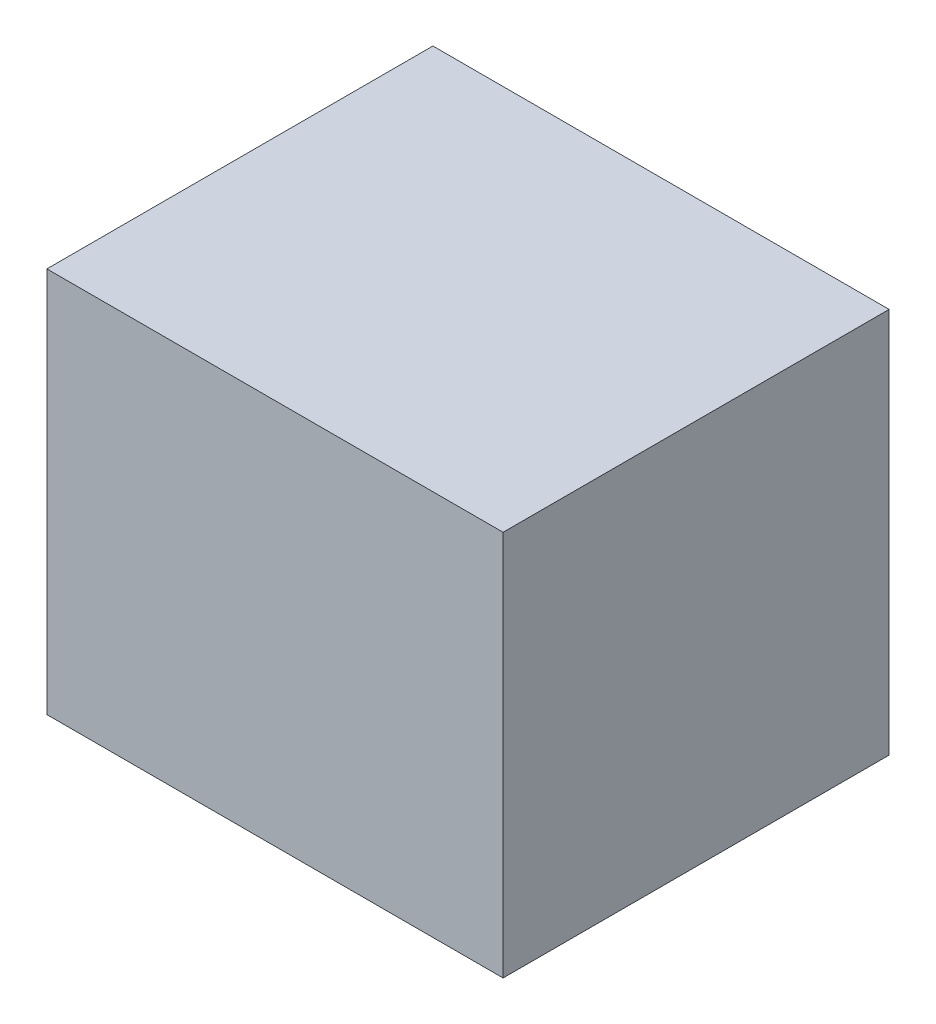
ISO-10303-21;
HEADER;
FILE_DESCRIPTION(('STEP AP214'),'2;1');
FILE_NAME('part.step','',(''),(''),'','','');
FILE_SCHEMA(('AUTOMOTIVE_DESIGN { 1 0 10303 214 1 1 1 1 }'));
ENDSEC;
DATA;
#1=APPLICATION_CONTEXT('core data for automotive mechanical design processes');
#2=APPLICATION_PROTOCOL_DEFINITION('international standard','automotive_design',2000,#1);
#3=PRODUCT_CONTEXT('',#1,'mechanical');
#4=PRODUCT('Part','Part','',(#3));
#5=PRODUCT_RELATED_PRODUCT_CATEGORY('part','',(#4));
#6=PRODUCT_DEFINITION_FORMATION('','',#4);
#7=PRODUCT_DEFINITION_CONTEXT('part definition',#1,'design');
#8=PRODUCT_DEFINITION('design','',#6,#7);
#9=PRODUCT_DEFINITION_SHAPE('','',#8);
#10=(LENGTH_UNIT() NAMED_UNIT(*) SI_UNIT(.MILLI.,.METRE.));
#11=(NAMED_UNIT(*) PLANE_ANGLE_UNIT() SI_UNIT($,.RADIAN.));
#12=(NAMED_UNIT(*) SI_UNIT($,.STERADIAN.) SOLID_ANGLE_UNIT());
#13=UNCERTAINTY_MEASURE_WITH_UNIT(LENGTH_MEASURE(1.E-05),#10,'distance_accuracy_value','');
#14=(GEOMETRIC_REPRESENTATION_CONTEXT(3) GLOBAL_UNCERTAINTY_ASSIGNED_CONTEXT((#13)) GLOBAL_UNIT_ASSIGNED_CONTEXT((#10,
#11,#12)) REPRESENTATION_CONTEXT('',''));
#15=CARTESIAN_POINT('',(0.,0.,0.));
#16=DIRECTION('',(0.,0.,1.));
#17=DIRECTION('',(1.,0.,0.));
#18=AXIS2_PLACEMENT_3D('',#15,#16,#17);
#19=CARTESIAN_POINT('',(325.,275.,0.));
#20=DIRECTION('',(0.707106781186546,0.,-0.707106781186549));
#21=DIRECTION('',(-0.707106781186549,0.,-0.707106781186546));
#22=AXIS2_PLACEMENT_3D('',#19,#20,#21);
#23=PLANE('',#22);
#24=DIRECTION('',(0.,1.,0.));
#25=VECTOR('',#24,1.);
#26=CARTESIAN_POINT('',(325.,275.,0.));
#27=LINE('',#26,#25);
#28=CARTESIAN_POINT('',(325.,-275.,0.));
#29=VERTEX_POINT('',#28);
#30=CARTESIAN_POINT('',(325.,275.,0.));
#31=VERTEX_POINT('',#30);
#32=EDGE_CURVE('E126',#29,#31,#27,.T.);
#33=ORIENTED_EDGE('',*,*,#32,.F.);
#34=DIRECTION('',(0.577350269189627,-0.577350269189627,0.577350269189624));
#35=VECTOR('',#34,1.);
#36=CARTESIAN_POINT('',(108.333333333333,-58.3333333333329,-216.666666666666));
#37=LINE('',#36,#35);
#38=CARTESIAN_POINT('',(295.,-245.,-30.));
#39=VERTEX_POINT('',#38);
#40=EDGE_CURVE('E11',#39,#29,#37,.T.);
#41=ORIENTED_EDGE('',*,*,#40,.F.);
#42=DIRECTION('',(0.,1.,0.));
#43=VECTOR('',#42,1.);
#44=CARTESIAN_POINT('',(295.,0.,-30.));
#45=LINE('',#44,#43);
#46=CARTESIAN_POINT('',(295.,245.,-30.));
#47=VERTEX_POINT('',#46);
#48=EDGE_CURVE('E146',#39,#47,#45,.T.);
#49=ORIENTED_EDGE('',*,*,#48,.T.);
#50=DIRECTION('',(0.577350269189626,0.577350269189627,0.577350269189624));
#51=VECTOR('',#50,1.);
#52=CARTESIAN_POINT('',(325.,275.,0.));
#53=LINE('',#52,#51);
#54=EDGE_CURVE('E77',#47,#31,#53,.T.);
#55=ORIENTED_EDGE('',*,*,#54,.T.);
#56=EDGE_LOOP('',(#33,#41,#49,#55));
#57=FACE_BOUND('',#56,.T.);
#58=ADVANCED_FACE('F39',(#57),#23,.T.);
#59=CARTESIAN_POINT('',(-325.,-275.,0.));
#60=DIRECTION('',(0.,-0.707106781186546,-0.707106781186549));
#61=DIRECTION('',(0.,0.707106781186549,-0.707106781186546));
#62=AXIS2_PLACEMENT_3D('',#59,#60,#61);
#63=PLANE('',#62);
#64=DIRECTION('',(1.,0.,0.));
#65=VECTOR('',#64,1.);
#66=CARTESIAN_POINT('',(-325.,-275.,0.));
#67=LINE('',#66,#65);
#68=CARTESIAN_POINT('',(-325.,-275.,0.));
#69=VERTEX_POINT('',#68);
#70=EDGE_CURVE('E143',#69,#29,#67,.T.);
#71=ORIENTED_EDGE('',*,*,#70,.F.);
#72=DIRECTION('',(-0.577350269189626,-0.577350269189627,0.577350269189624));
#73=VECTOR('',#72,1.);
#74=CARTESIAN_POINT('',(-141.666666666666,-91.6666666666663,-183.333333333333));
#75=LINE('',#74,#73);
#76=CARTESIAN_POINT('',(-295.,-245.,-30.));
#77=VERTEX_POINT('',#76);
#78=EDGE_CURVE('E50',#77,#69,#75,.T.);
#79=ORIENTED_EDGE('',*,*,#78,.F.);
#80=DIRECTION('',(1.,0.,0.));
#81=VECTOR('',#80,1.);
#82=CARTESIAN_POINT('',(0.,-245.,-30.));
#83=LINE('',#82,#81);
#84=EDGE_CURVE('E150',#77,#39,#83,.T.);
#85=ORIENTED_EDGE('',*,*,#84,.T.);
#86=ORIENTED_EDGE('',*,*,#40,.T.);
#87=EDGE_LOOP('',(#71,#79,#85,#86));
#88=FACE_BOUND('',#87,.T.);
#89=ADVANCED_FACE('F41',(#88),#63,.T.);
#90=CARTESIAN_POINT('',(-325.,275.,0.));
#91=DIRECTION('',(-0.707106781186546,0.,-0.707106781186549));
#92=DIRECTION('',(-0.707106781186549,0.,0.707106781186546));
#93=AXIS2_PLACEMENT_3D('',#90,#91,#92);
#94=PLANE('',#93);
#95=DIRECTION('',(0.,-1.,0.));
#96=VECTOR('',#95,1.);
#97=CARTESIAN_POINT('',(-325.,275.,0.));
#98=LINE('',#97,#96);
#99=CARTESIAN_POINT('',(-325.,275.,0.));
#100=VERTEX_POINT('',#99);
#101=EDGE_CURVE('E139',#100,#69,#98,.T.);
#102=ORIENTED_EDGE('',*,*,#101,.F.);
#103=DIRECTION('',(-0.577350269189627,0.577350269189627,0.577350269189624));
#104=VECTOR('',#103,1.);
#105=CARTESIAN_POINT('',(-325.,275.,0.));
#106=LINE('',#105,#104);
#107=CARTESIAN_POINT('',(-295.,245.,-30.));
#108=VERTEX_POINT('',#107);
#109=EDGE_CURVE('E70',#108,#100,#106,.T.);
#110=ORIENTED_EDGE('',*,*,#109,.F.);
#111=DIRECTION('',(0.,-1.,0.));
#112=VECTOR('',#111,1.);
#113=CARTESIAN_POINT('',(-295.,0.,-30.));
#114=LINE('',#113,#112);
#115=EDGE_CURVE('E159',#108,#77,#114,.T.);
#116=ORIENTED_EDGE('',*,*,#115,.T.);
#117=ORIENTED_EDGE('',*,*,#78,.T.);
#118=EDGE_LOOP('',(#102,#110,#116,#117));
#119=FACE_BOUND('',#118,.T.);
#120=ADVANCED_FACE('F182',(#119),#94,.T.);
#121=CARTESIAN_POINT('',(-325.,275.,0.));
#122=DIRECTION('',(0.,0.707106781186546,-0.707106781186549));
#123=DIRECTION('',(0.,0.707106781186549,0.707106781186546));
#124=AXIS2_PLACEMENT_3D('',#121,#122,#123);
#125=PLANE('',#124);
#126=DIRECTION('',(-1.,0.,0.));
#127=VECTOR('',#126,1.);
#128=CARTESIAN_POINT('',(-325.,275.,0.));
#129=LINE('',#128,#127);
#130=EDGE_CURVE('E131',#31,#100,#129,.T.);
#131=ORIENTED_EDGE('',*,*,#130,.F.);
#132=ORIENTED_EDGE('',*,*,#54,.F.);
#133=DIRECTION('',(-1.,0.,0.));
#134=VECTOR('',#133,1.);
#135=CARTESIAN_POINT('',(0.,245.,-30.));
#136=LINE('',#135,#134);
#137=EDGE_CURVE('E43',#47,#108,#136,.T.);
#138=ORIENTED_EDGE('',*,*,#137,.T.);
#139=ORIENTED_EDGE('',*,*,#109,.T.);
#140=EDGE_LOOP('',(#131,#132,#138,#139));
#141=FACE_BOUND('',#140,.T.);
#142=ADVANCED_FACE('F163',(#141),#125,.T.);
#143=CARTESIAN_POINT('',(0.,0.,-30.));
#144=DIRECTION('',(0.,0.,1.));
#145=DIRECTION('',(1.,0.,0.));
#146=AXIS2_PLACEMENT_3D('',#143,#144,#145);
#147=PLANE('',#146);
#148=ORIENTED_EDGE('',*,*,#48,.F.);
#149=ORIENTED_EDGE('',*,*,#84,.F.);
#150=ORIENTED_EDGE('',*,*,#115,.F.);
#151=ORIENTED_EDGE('',*,*,#137,.F.);
#152=EDGE_LOOP('',(#148,#149,#150,#151));
#153=FACE_BOUND('',#152,.T.);
#154=ADVANCED_FACE('F165',(#153),#147,.F.);
#155=CARTESIAN_POINT('',(325.,275.,550.));
#156=DIRECTION('',(-1.,0.,0.));
#157=DIRECTION('',(0.,-1.,0.));
#158=AXIS2_PLACEMENT_3D('',#155,#156,#157);
#159=PLANE('',#158);
#160=ORIENTED_EDGE('',*,*,#32,.T.);
#161=DIRECTION('',(0.,0.,-1.));
#162=VECTOR('',#161,1.);
#163=CARTESIAN_POINT('',(325.,275.,550.));
#164=LINE('',#163,#162);
#165=CARTESIAN_POINT('',(325.,275.,550.));
#166=VERTEX_POINT('',#165);
#167=EDGE_CURVE('E106',#166,#31,#164,.T.);
#168=ORIENTED_EDGE('',*,*,#167,.F.);
#169=DIRECTION('',(0.,1.,0.));
#170=VECTOR('',#169,1.);
#171=CARTESIAN_POINT('',(325.,275.,550.));
#172=LINE('',#171,#170);
#173=CARTESIAN_POINT('',(325.,-275.,550.));
#174=VERTEX_POINT('',#173);
#175=EDGE_CURVE('E114',#174,#166,#172,.T.);
#176=ORIENTED_EDGE('',*,*,#175,.F.);
#177=DIRECTION('',(0.,0.,-1.));
#178=VECTOR('',#177,1.);
#179=CARTESIAN_POINT('',(325.,-275.,550.));
#180=LINE('',#179,#178);
#181=EDGE_CURVE('E173',#174,#29,#180,.T.);
#182=ORIENTED_EDGE('',*,*,#181,.T.);
#183=EDGE_LOOP('',(#160,#168,#176,#182));
#184=FACE_BOUND('',#183,.T.);
#185=ADVANCED_FACE('F125',(#184),#159,.F.);
#186=CARTESIAN_POINT('',(-325.,275.,550.));
#187=DIRECTION('',(0.,-1.,0.));
#188=DIRECTION('',(0.,0.,-1.));
#189=AXIS2_PLACEMENT_3D('',#186,#187,#188);
#190=PLANE('',#189);
#191=ORIENTED_EDGE('',*,*,#130,.T.);
#192=DIRECTION('',(0.,0.,-1.));
#193=VECTOR('',#192,1.);
#194=CARTESIAN_POINT('',(-325.,275.,550.));
#195=LINE('',#194,#193);
#196=CARTESIAN_POINT('',(-325.,275.,550.));
#197=VERTEX_POINT('',#196);
#198=EDGE_CURVE('E109',#197,#100,#195,.T.);
#199=ORIENTED_EDGE('',*,*,#198,.F.);
#200=DIRECTION('',(-1.,0.,0.));
#201=VECTOR('',#200,1.);
#202=CARTESIAN_POINT('',(-325.,275.,550.));
#203=LINE('',#202,#201);
#204=EDGE_CURVE('E101',#166,#197,#203,.T.);
#205=ORIENTED_EDGE('',*,*,#204,.F.);
#206=ORIENTED_EDGE('',*,*,#167,.T.);
#207=EDGE_LOOP('',(#191,#199,#205,#206));
#208=FACE_BOUND('',#207,.T.);
#209=ADVANCED_FACE('F104',(#208),#190,.F.);
#210=CARTESIAN_POINT('',(-325.,275.,550.));
#211=DIRECTION('',(1.,0.,0.));
#212=DIRECTION('',(0.,1.,0.));
#213=AXIS2_PLACEMENT_3D('',#210,#211,#212);
#214=PLANE('',#213);
#215=ORIENTED_EDGE('',*,*,#101,.T.);
#216=DIRECTION('',(0.,0.,-1.));
#217=VECTOR('',#216,1.);
#218=CARTESIAN_POINT('',(-325.,-275.,550.));
#219=LINE('',#218,#217);
#220=CARTESIAN_POINT('',(-325.,-275.,550.));
#221=VERTEX_POINT('',#220);
#222=EDGE_CURVE('E133',#221,#69,#219,.T.);
#223=ORIENTED_EDGE('',*,*,#222,.F.);
#224=DIRECTION('',(0.,-1.,0.));
#225=VECTOR('',#224,1.);
#226=CARTESIAN_POINT('',(-325.,275.,550.));
#227=LINE('',#226,#225);
#228=EDGE_CURVE('E113',#197,#221,#227,.T.);
#229=ORIENTED_EDGE('',*,*,#228,.F.);
#230=ORIENTED_EDGE('',*,*,#198,.T.);
#231=EDGE_LOOP('',(#215,#223,#229,#230));
#232=FACE_BOUND('',#231,.T.);
#233=ADVANCED_FACE('F167',(#232),#214,.F.);
#234=CARTESIAN_POINT('',(-325.,-275.,550.));
#235=DIRECTION('',(0.,1.,0.));
#236=DIRECTION('',(0.,0.,1.));
#237=AXIS2_PLACEMENT_3D('',#234,#235,#236);
#238=PLANE('',#237);
#239=ORIENTED_EDGE('',*,*,#70,.T.);
#240=ORIENTED_EDGE('',*,*,#181,.F.);
#241=DIRECTION('',(1.,0.,0.));
#242=VECTOR('',#241,1.);
#243=CARTESIAN_POINT('',(-325.,-275.,550.));
#244=LINE('',#243,#242);
#245=EDGE_CURVE('E119',#221,#174,#244,.T.);
#246=ORIENTED_EDGE('',*,*,#245,.F.);
#247=ORIENTED_EDGE('',*,*,#222,.T.);
#248=EDGE_LOOP('',(#239,#240,#246,#247));
#249=FACE_BOUND('',#248,.T.);
#250=ADVANCED_FACE('F179',(#249),#238,.F.);
#251=CARTESIAN_POINT('',(0.,0.,550.));
#252=DIRECTION('',(0.,0.,1.));
#253=DIRECTION('',(1.,0.,0.));
#254=AXIS2_PLACEMENT_3D('',#251,#252,#253);
#255=PLANE('',#254);
#256=ORIENTED_EDGE('',*,*,#175,.T.);
#257=ORIENTED_EDGE('',*,*,#204,.T.);
#258=ORIENTED_EDGE('',*,*,#228,.T.);
#259=ORIENTED_EDGE('',*,*,#245,.T.);
#260=EDGE_LOOP('',(#256,#257,#258,#259));
#261=FACE_BOUND('',#260,.T.);
#262=ADVANCED_FACE('F117',(#261),#255,.T.);
#263=CLOSED_SHELL('',(#58,#89,#120,#142,#154,#185,#209,#233,#250,#262));
#264=MANIFOLD_SOLID_BREP('B2',#263);
#265=ADVANCED_BREP_SHAPE_REPRESENTATION('',(#18,#264),#14);
#266=SHAPE_DEFINITION_REPRESENTATION(#9,#265);
ENDSEC;
END-ISO-10303-21;
